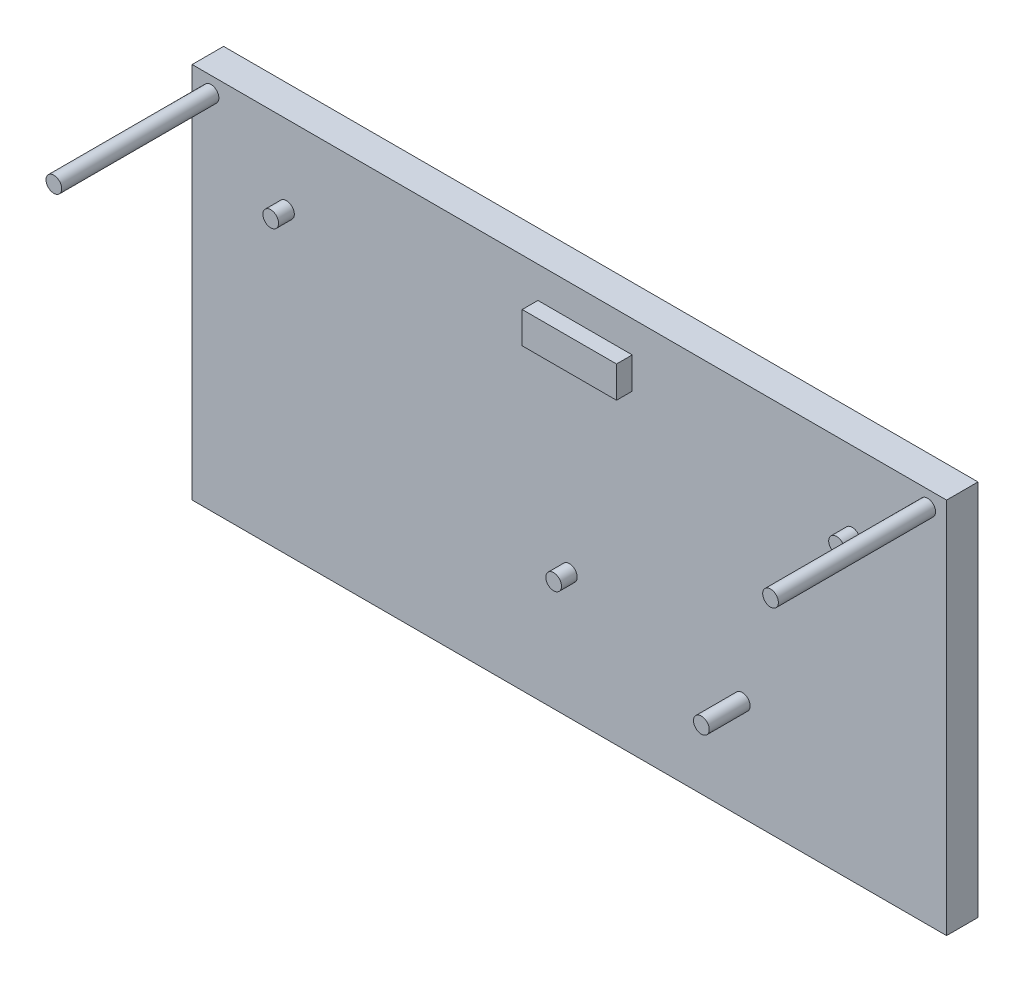
ISO-10303-21;
HEADER;
FILE_DESCRIPTION(('STEP AP214'),'2;1');
FILE_NAME('part.step','',(''),(''),'','','');
FILE_SCHEMA(('AUTOMOTIVE_DESIGN { 1 0 10303 214 1 1 1 1 }'));
ENDSEC;
DATA;
#1=APPLICATION_CONTEXT('core data for automotive mechanical design processes');
#2=APPLICATION_PROTOCOL_DEFINITION('international standard','automotive_design',2000,#1);
#3=PRODUCT_CONTEXT('',#1,'mechanical');
#4=PRODUCT('Part','Part','',(#3));
#5=PRODUCT_RELATED_PRODUCT_CATEGORY('part','',(#4));
#6=PRODUCT_DEFINITION_FORMATION('','',#4);
#7=PRODUCT_DEFINITION_CONTEXT('part definition',#1,'design');
#8=PRODUCT_DEFINITION('design','',#6,#7);
#9=PRODUCT_DEFINITION_SHAPE('','',#8);
#10=(LENGTH_UNIT() NAMED_UNIT(*) SI_UNIT(.MILLI.,.METRE.));
#11=(NAMED_UNIT(*) PLANE_ANGLE_UNIT() SI_UNIT($,.RADIAN.));
#12=(NAMED_UNIT(*) SI_UNIT($,.STERADIAN.) SOLID_ANGLE_UNIT());
#13=UNCERTAINTY_MEASURE_WITH_UNIT(LENGTH_MEASURE(1.E-05),#10,'distance_accuracy_value','');
#14=(GEOMETRIC_REPRESENTATION_CONTEXT(3) GLOBAL_UNCERTAINTY_ASSIGNED_CONTEXT((#13)) GLOBAL_UNIT_ASSIGNED_CONTEXT((#10,
#11,#12)) REPRESENTATION_CONTEXT('',''));
#15=CARTESIAN_POINT('',(0.,0.,0.));
#16=DIRECTION('',(0.,0.,1.));
#17=DIRECTION('',(1.,0.,0.));
#18=AXIS2_PLACEMENT_3D('',#15,#16,#17);
#19=CARTESIAN_POINT('',(60.,60.,0.));
#20=DIRECTION('',(0.,0.,1.));
#21=DIRECTION('',(1.,0.,0.));
#22=AXIS2_PLACEMENT_3D('',#19,#20,#21);
#23=PLANE('',#22);
#24=CARTESIAN_POINT('',(-114.,115.,0.));
#25=DIRECTION('',(0.,0.,-1.));
#26=DIRECTION('',(-1.,0.,0.));
#27=AXIS2_PLACEMENT_3D('',#24,#25,#26);
#28=CIRCLE('',#27,2.5);
#29=CARTESIAN_POINT('',(-111.5,115.,0.));
#30=VERTEX_POINT('',#29);
#31=EDGE_CURVE('E205',#30,#30,#28,.T.);
#32=ORIENTED_EDGE('',*,*,#31,.T.);
#33=EDGE_LOOP('',(#32));
#34=FACE_BOUND('',#33,.T.);
#35=CARTESIAN_POINT('',(114.,115.,0.));
#36=DIRECTION('',(0.,0.,-1.));
#37=DIRECTION('',(-1.,0.,0.));
#38=AXIS2_PLACEMENT_3D('',#35,#36,#37);
#39=CIRCLE('',#38,2.5);
#40=CARTESIAN_POINT('',(116.5,115.,0.));
#41=VERTEX_POINT('',#40);
#42=EDGE_CURVE('E196',#41,#41,#39,.T.);
#43=ORIENTED_EDGE('',*,*,#42,.T.);
#44=EDGE_LOOP('',(#43));
#45=FACE_BOUND('',#44,.T.);
#46=CARTESIAN_POINT('',(0.,40.,0.));
#47=DIRECTION('',(0.,0.,-1.));
#48=DIRECTION('',(-1.,0.,0.));
#49=AXIS2_PLACEMENT_3D('',#46,#47,#48);
#50=CIRCLE('',#49,2.5);
#51=CARTESIAN_POINT('',(2.5,40.,0.));
#52=VERTEX_POINT('',#51);
#53=EDGE_CURVE('E223',#52,#52,#50,.T.);
#54=ORIENTED_EDGE('',*,*,#53,.T.);
#55=EDGE_LOOP('',(#54));
#56=FACE_BOUND('',#55,.T.);
#57=CARTESIAN_POINT('',(-90.,95.,0.));
#58=DIRECTION('',(0.,0.,-1.));
#59=DIRECTION('',(-1.,0.,0.));
#60=AXIS2_PLACEMENT_3D('',#57,#58,#59);
#61=CIRCLE('',#60,2.5);
#62=CARTESIAN_POINT('',(-87.5,95.,0.));
#63=VERTEX_POINT('',#62);
#64=EDGE_CURVE('E228',#63,#63,#61,.T.);
#65=ORIENTED_EDGE('',*,*,#64,.T.);
#66=EDGE_LOOP('',(#65));
#67=FACE_BOUND('',#66,.T.);
#68=CARTESIAN_POINT('',(90.,95.,0.));
#69=DIRECTION('',(0.,0.,-1.));
#70=DIRECTION('',(-1.,0.,0.));
#71=AXIS2_PLACEMENT_3D('',#68,#69,#70);
#72=CIRCLE('',#71,2.5);
#73=CARTESIAN_POINT('',(92.5,95.,0.));
#74=VERTEX_POINT('',#73);
#75=EDGE_CURVE('E186',#74,#74,#72,.T.);
#76=ORIENTED_EDGE('',*,*,#75,.T.);
#77=EDGE_LOOP('',(#76));
#78=FACE_BOUND('',#77,.T.);
#79=DIRECTION('',(0.,-1.,0.));
#80=VECTOR('',#79,1.);
#81=CARTESIAN_POINT('',(20.,110.,0.));
#82=LINE('',#81,#80);
#83=CARTESIAN_POINT('',(20.,110.,0.));
#84=VERTEX_POINT('',#83);
#85=CARTESIAN_POINT('',(20.,100.,0.));
#86=VERTEX_POINT('',#85);
#87=EDGE_CURVE('E150',#84,#86,#82,.T.);
#88=ORIENTED_EDGE('',*,*,#87,.T.);
#89=DIRECTION('',(-1.,0.,0.));
#90=VECTOR('',#89,1.);
#91=CARTESIAN_POINT('',(20.,100.,0.));
#92=LINE('',#91,#90);
#93=CARTESIAN_POINT('',(-10.,100.,0.));
#94=VERTEX_POINT('',#93);
#95=EDGE_CURVE('E267',#86,#94,#92,.T.);
#96=ORIENTED_EDGE('',*,*,#95,.T.);
#97=DIRECTION('',(0.,1.,0.));
#98=VECTOR('',#97,1.);
#99=CARTESIAN_POINT('',(-10.,100.,0.));
#100=LINE('',#99,#98);
#101=CARTESIAN_POINT('',(-10.,110.,0.));
#102=VERTEX_POINT('',#101);
#103=EDGE_CURVE('E153',#94,#102,#100,.T.);
#104=ORIENTED_EDGE('',*,*,#103,.T.);
#105=DIRECTION('',(1.,0.,0.));
#106=VECTOR('',#105,1.);
#107=CARTESIAN_POINT('',(-10.,110.,0.));
#108=LINE('',#107,#106);
#109=EDGE_CURVE('E145',#102,#84,#108,.T.);
#110=ORIENTED_EDGE('',*,*,#109,.T.);
#111=EDGE_LOOP('',(#88,#96,#104,#110));
#112=FACE_BOUND('',#111,.T.);
#113=CARTESIAN_POINT('',(55.,32.,0.));
#114=DIRECTION('',(0.,0.,-1.));
#115=DIRECTION('',(-1.,0.,0.));
#116=AXIS2_PLACEMENT_3D('',#113,#114,#115);
#117=CIRCLE('',#116,2.5);
#118=CARTESIAN_POINT('',(57.5,32.,0.));
#119=VERTEX_POINT('',#118);
#120=EDGE_CURVE('E187',#119,#119,#117,.T.);
#121=ORIENTED_EDGE('',*,*,#120,.T.);
#122=EDGE_LOOP('',(#121));
#123=FACE_BOUND('',#122,.T.);
#124=DIRECTION('',(1.,0.,0.));
#125=VECTOR('',#124,1.);
#126=CARTESIAN_POINT('',(-120.,0.,0.));
#127=LINE('',#126,#125);
#128=CARTESIAN_POINT('',(-120.,0.,0.));
#129=VERTEX_POINT('',#128);
#130=CARTESIAN_POINT('',(120.,0.,0.));
#131=VERTEX_POINT('',#130);
#132=EDGE_CURVE('E9',#129,#131,#127,.T.);
#133=ORIENTED_EDGE('',*,*,#132,.T.);
#134=DIRECTION('',(0.,1.,0.));
#135=VECTOR('',#134,1.);
#136=CARTESIAN_POINT('',(120.,0.,0.));
#137=LINE('',#136,#135);
#138=CARTESIAN_POINT('',(120.,120.,0.));
#139=VERTEX_POINT('',#138);
#140=EDGE_CURVE('E191',#131,#139,#137,.T.);
#141=ORIENTED_EDGE('',*,*,#140,.T.);
#142=DIRECTION('',(-1.,0.,0.));
#143=VECTOR('',#142,1.);
#144=CARTESIAN_POINT('',(120.,120.,0.));
#145=LINE('',#144,#143);
#146=CARTESIAN_POINT('',(-120.,120.,0.));
#147=VERTEX_POINT('',#146);
#148=EDGE_CURVE('E207',#139,#147,#145,.T.);
#149=ORIENTED_EDGE('',*,*,#148,.T.);
#150=DIRECTION('',(0.,-1.,0.));
#151=VECTOR('',#150,1.);
#152=CARTESIAN_POINT('',(-120.,120.,0.));
#153=LINE('',#152,#151);
#154=EDGE_CURVE('E242',#147,#129,#153,.T.);
#155=ORIENTED_EDGE('',*,*,#154,.T.);
#156=EDGE_LOOP('',(#133,#141,#149,#155));
#157=FACE_BOUND('',#156,.T.);
#158=ADVANCED_FACE('F15',(#34,#45,#56,#67,#78,#112,#123,#157),#23,.T.);
#159=CARTESIAN_POINT('',(60.,60.,-10.));
#160=DIRECTION('',(0.,0.,1.));
#161=DIRECTION('',(1.,0.,0.));
#162=AXIS2_PLACEMENT_3D('',#159,#160,#161);
#163=PLANE('',#162);
#164=DIRECTION('',(0.,1.,0.));
#165=VECTOR('',#164,1.);
#166=CARTESIAN_POINT('',(120.,0.,-10.));
#167=LINE('',#166,#165);
#168=CARTESIAN_POINT('',(120.,0.,-10.));
#169=VERTEX_POINT('',#168);
#170=CARTESIAN_POINT('',(120.,120.,-10.));
#171=VERTEX_POINT('',#170);
#172=EDGE_CURVE('E263',#169,#171,#167,.T.);
#173=ORIENTED_EDGE('',*,*,#172,.F.);
#174=DIRECTION('',(1.,0.,0.));
#175=VECTOR('',#174,1.);
#176=CARTESIAN_POINT('',(-120.,0.,-10.));
#177=LINE('',#176,#175);
#178=CARTESIAN_POINT('',(-120.,0.,-10.));
#179=VERTEX_POINT('',#178);
#180=EDGE_CURVE('E26',#179,#169,#177,.T.);
#181=ORIENTED_EDGE('',*,*,#180,.F.);
#182=DIRECTION('',(0.,-1.,0.));
#183=VECTOR('',#182,1.);
#184=CARTESIAN_POINT('',(-120.,120.,-10.));
#185=LINE('',#184,#183);
#186=CARTESIAN_POINT('',(-120.,120.,-10.));
#187=VERTEX_POINT('',#186);
#188=EDGE_CURVE('E182',#187,#179,#185,.T.);
#189=ORIENTED_EDGE('',*,*,#188,.F.);
#190=DIRECTION('',(-1.,0.,0.));
#191=VECTOR('',#190,1.);
#192=CARTESIAN_POINT('',(120.,120.,-10.));
#193=LINE('',#192,#191);
#194=EDGE_CURVE('E214',#171,#187,#193,.T.);
#195=ORIENTED_EDGE('',*,*,#194,.F.);
#196=EDGE_LOOP('',(#173,#181,#189,#195));
#197=FACE_BOUND('',#196,.T.);
#198=ADVANCED_FACE('F303',(#197),#163,.F.);
#199=CARTESIAN_POINT('',(0.,0.,0.));
#200=DIRECTION('',(0.,-1.,0.));
#201=DIRECTION('',(0.,0.,-1.));
#202=AXIS2_PLACEMENT_3D('',#199,#200,#201);
#203=PLANE('',#202);
#204=ORIENTED_EDGE('',*,*,#180,.T.);
#205=DIRECTION('',(0.,0.,-1.));
#206=VECTOR('',#205,1.);
#207=CARTESIAN_POINT('',(120.,0.,0.));
#208=LINE('',#207,#206);
#209=EDGE_CURVE('E194',#131,#169,#208,.T.);
#210=ORIENTED_EDGE('',*,*,#209,.F.);
#211=ORIENTED_EDGE('',*,*,#132,.F.);
#212=DIRECTION('',(0.,0.,-1.));
#213=VECTOR('',#212,1.);
#214=CARTESIAN_POINT('',(-120.,0.,0.));
#215=LINE('',#214,#213);
#216=EDGE_CURVE('E256',#129,#179,#215,.T.);
#217=ORIENTED_EDGE('',*,*,#216,.T.);
#218=EDGE_LOOP('',(#204,#210,#211,#217));
#219=FACE_BOUND('',#218,.T.);
#220=ADVANCED_FACE('F403',(#219),#203,.T.);
#221=CARTESIAN_POINT('',(120.,120.,0.));
#222=DIRECTION('',(0.,1.,0.));
#223=DIRECTION('',(1.,0.,0.));
#224=AXIS2_PLACEMENT_3D('',#221,#222,#223);
#225=PLANE('',#224);
#226=ORIENTED_EDGE('',*,*,#194,.T.);
#227=DIRECTION('',(0.,0.,-1.));
#228=VECTOR('',#227,1.);
#229=CARTESIAN_POINT('',(-120.,120.,0.));
#230=LINE('',#229,#228);
#231=EDGE_CURVE('E259',#147,#187,#230,.T.);
#232=ORIENTED_EDGE('',*,*,#231,.F.);
#233=ORIENTED_EDGE('',*,*,#148,.F.);
#234=DIRECTION('',(0.,0.,-1.));
#235=VECTOR('',#234,1.);
#236=CARTESIAN_POINT('',(120.,120.,0.));
#237=LINE('',#236,#235);
#238=EDGE_CURVE('E195',#139,#171,#237,.T.);
#239=ORIENTED_EDGE('',*,*,#238,.T.);
#240=EDGE_LOOP('',(#226,#232,#233,#239));
#241=FACE_BOUND('',#240,.T.);
#242=ADVANCED_FACE('F297',(#241),#225,.T.);
#243=CARTESIAN_POINT('',(120.,0.,0.));
#244=DIRECTION('',(1.,0.,0.));
#245=DIRECTION('',(0.,1.,0.));
#246=AXIS2_PLACEMENT_3D('',#243,#244,#245);
#247=PLANE('',#246);
#248=ORIENTED_EDGE('',*,*,#172,.T.);
#249=ORIENTED_EDGE('',*,*,#238,.F.);
#250=ORIENTED_EDGE('',*,*,#140,.F.);
#251=ORIENTED_EDGE('',*,*,#209,.T.);
#252=EDGE_LOOP('',(#248,#249,#250,#251));
#253=FACE_BOUND('',#252,.T.);
#254=ADVANCED_FACE('F301',(#253),#247,.T.);
#255=CARTESIAN_POINT('',(-120.,120.,0.));
#256=DIRECTION('',(-1.,0.,0.));
#257=DIRECTION('',(0.,0.,1.));
#258=AXIS2_PLACEMENT_3D('',#255,#256,#257);
#259=PLANE('',#258);
#260=ORIENTED_EDGE('',*,*,#188,.T.);
#261=ORIENTED_EDGE('',*,*,#216,.F.);
#262=ORIENTED_EDGE('',*,*,#154,.F.);
#263=ORIENTED_EDGE('',*,*,#231,.T.);
#264=EDGE_LOOP('',(#260,#261,#262,#263));
#265=FACE_BOUND('',#264,.T.);
#266=ADVANCED_FACE('F402',(#265),#259,.T.);
#267=CARTESIAN_POINT('',(-114.,115.,50.));
#268=DIRECTION('',(0.,0.,-1.));
#269=DIRECTION('',(0.,-1.,0.));
#270=AXIS2_PLACEMENT_3D('',#267,#268,#269);
#271=PLANE('',#270);
#272=CARTESIAN_POINT('',(-114.,115.,50.));
#273=DIRECTION('',(0.,0.,-1.));
#274=DIRECTION('',(-1.,0.,0.));
#275=AXIS2_PLACEMENT_3D('',#272,#273,#274);
#276=CIRCLE('',#275,2.5);
#277=CARTESIAN_POINT('',(-111.5,115.,50.));
#278=VERTEX_POINT('',#277);
#279=EDGE_CURVE('E199',#278,#278,#276,.T.);
#280=ORIENTED_EDGE('',*,*,#279,.F.);
#281=EDGE_LOOP('',(#280));
#282=FACE_BOUND('',#281,.T.);
#283=ADVANCED_FACE('F428',(#282),#271,.F.);
#284=CARTESIAN_POINT('',(-114.,115.,0.));
#285=DIRECTION('',(0.,0.,1.));
#286=DIRECTION('',(-1.,0.,0.));
#287=AXIS2_PLACEMENT_3D('',#284,#285,#286);
#288=CYLINDRICAL_SURFACE('',#287,2.5);
#289=ORIENTED_EDGE('',*,*,#31,.F.);
#290=EDGE_LOOP('',(#289));
#291=FACE_BOUND('',#290,.T.);
#292=ORIENTED_EDGE('',*,*,#279,.T.);
#293=EDGE_LOOP('',(#292));
#294=FACE_BOUND('',#293,.T.);
#295=ADVANCED_FACE('F431',(#291,#294),#288,.T.);
#296=CARTESIAN_POINT('',(114.,115.,50.));
#297=DIRECTION('',(0.,0.,-1.));
#298=DIRECTION('',(0.,-1.,0.));
#299=AXIS2_PLACEMENT_3D('',#296,#297,#298);
#300=PLANE('',#299);
#301=CARTESIAN_POINT('',(114.,115.,50.));
#302=DIRECTION('',(0.,0.,-1.));
#303=DIRECTION('',(-1.,0.,0.));
#304=AXIS2_PLACEMENT_3D('',#301,#302,#303);
#305=CIRCLE('',#304,2.5);
#306=CARTESIAN_POINT('',(116.5,115.,50.));
#307=VERTEX_POINT('',#306);
#308=EDGE_CURVE('E200',#307,#307,#305,.T.);
#309=ORIENTED_EDGE('',*,*,#308,.F.);
#310=EDGE_LOOP('',(#309));
#311=FACE_BOUND('',#310,.T.);
#312=ADVANCED_FACE('F421',(#311),#300,.F.);
#313=CARTESIAN_POINT('',(114.,115.,0.));
#314=DIRECTION('',(0.,0.,1.));
#315=DIRECTION('',(-1.,0.,0.));
#316=AXIS2_PLACEMENT_3D('',#313,#314,#315);
#317=CYLINDRICAL_SURFACE('',#316,2.5);
#318=ORIENTED_EDGE('',*,*,#42,.F.);
#319=EDGE_LOOP('',(#318));
#320=FACE_BOUND('',#319,.T.);
#321=ORIENTED_EDGE('',*,*,#308,.T.);
#322=EDGE_LOOP('',(#321));
#323=FACE_BOUND('',#322,.T.);
#324=ADVANCED_FACE('F474',(#320,#323),#317,.T.);
#325=CARTESIAN_POINT('',(0.,40.,5.));
#326=DIRECTION('',(0.,0.,-1.));
#327=DIRECTION('',(0.,-1.,0.));
#328=AXIS2_PLACEMENT_3D('',#325,#326,#327);
#329=PLANE('',#328);
#330=CARTESIAN_POINT('',(0.,40.,5.));
#331=DIRECTION('',(0.,0.,-1.));
#332=DIRECTION('',(-1.,0.,0.));
#333=AXIS2_PLACEMENT_3D('',#330,#331,#332);
#334=CIRCLE('',#333,2.5);
#335=CARTESIAN_POINT('',(2.5,40.,5.));
#336=VERTEX_POINT('',#335);
#337=EDGE_CURVE('E226',#336,#336,#334,.T.);
#338=ORIENTED_EDGE('',*,*,#337,.F.);
#339=EDGE_LOOP('',(#338));
#340=FACE_BOUND('',#339,.T.);
#341=ADVANCED_FACE('F447',(#340),#329,.F.);
#342=CARTESIAN_POINT('',(0.,40.,0.));
#343=DIRECTION('',(0.,0.,1.));
#344=DIRECTION('',(-1.,0.,0.));
#345=AXIS2_PLACEMENT_3D('',#342,#343,#344);
#346=CYLINDRICAL_SURFACE('',#345,2.5);
#347=ORIENTED_EDGE('',*,*,#53,.F.);
#348=EDGE_LOOP('',(#347));
#349=FACE_BOUND('',#348,.T.);
#350=ORIENTED_EDGE('',*,*,#337,.T.);
#351=EDGE_LOOP('',(#350));
#352=FACE_BOUND('',#351,.T.);
#353=ADVANCED_FACE('F443',(#349,#352),#346,.T.);
#354=CARTESIAN_POINT('',(-90.,95.,5.));
#355=DIRECTION('',(0.,0.,-1.));
#356=DIRECTION('',(0.,-1.,0.));
#357=AXIS2_PLACEMENT_3D('',#354,#355,#356);
#358=PLANE('',#357);
#359=CARTESIAN_POINT('',(-90.,95.,5.));
#360=DIRECTION('',(0.,0.,-1.));
#361=DIRECTION('',(-1.,0.,0.));
#362=AXIS2_PLACEMENT_3D('',#359,#360,#361);
#363=CIRCLE('',#362,2.5);
#364=CARTESIAN_POINT('',(-87.5,95.,5.));
#365=VERTEX_POINT('',#364);
#366=EDGE_CURVE('E202',#365,#365,#363,.T.);
#367=ORIENTED_EDGE('',*,*,#366,.F.);
#368=EDGE_LOOP('',(#367));
#369=FACE_BOUND('',#368,.T.);
#370=ADVANCED_FACE('F446',(#369),#358,.F.);
#371=CARTESIAN_POINT('',(-90.,95.,0.));
#372=DIRECTION('',(0.,0.,1.));
#373=DIRECTION('',(-1.,0.,0.));
#374=AXIS2_PLACEMENT_3D('',#371,#372,#373);
#375=CYLINDRICAL_SURFACE('',#374,2.5);
#376=ORIENTED_EDGE('',*,*,#64,.F.);
#377=EDGE_LOOP('',(#376));
#378=FACE_BOUND('',#377,.T.);
#379=ORIENTED_EDGE('',*,*,#366,.T.);
#380=EDGE_LOOP('',(#379));
#381=FACE_BOUND('',#380,.T.);
#382=ADVANCED_FACE('F455',(#378,#381),#375,.T.);
#383=CARTESIAN_POINT('',(90.,95.,5.));
#384=DIRECTION('',(0.,0.,-1.));
#385=DIRECTION('',(0.,-1.,0.));
#386=AXIS2_PLACEMENT_3D('',#383,#384,#385);
#387=PLANE('',#386);
#388=CARTESIAN_POINT('',(90.,95.,5.));
#389=DIRECTION('',(0.,0.,-1.));
#390=DIRECTION('',(-1.,0.,0.));
#391=AXIS2_PLACEMENT_3D('',#388,#389,#390);
#392=CIRCLE('',#391,2.5);
#393=CARTESIAN_POINT('',(92.5,95.,5.));
#394=VERTEX_POINT('',#393);
#395=EDGE_CURVE('E158',#394,#394,#392,.T.);
#396=ORIENTED_EDGE('',*,*,#395,.F.);
#397=EDGE_LOOP('',(#396));
#398=FACE_BOUND('',#397,.T.);
#399=ADVANCED_FACE('F452',(#398),#387,.F.);
#400=CARTESIAN_POINT('',(90.,95.,0.));
#401=DIRECTION('',(0.,0.,1.));
#402=DIRECTION('',(-1.,0.,0.));
#403=AXIS2_PLACEMENT_3D('',#400,#401,#402);
#404=CYLINDRICAL_SURFACE('',#403,2.5);
#405=ORIENTED_EDGE('',*,*,#75,.F.);
#406=EDGE_LOOP('',(#405));
#407=FACE_BOUND('',#406,.T.);
#408=ORIENTED_EDGE('',*,*,#395,.T.);
#409=EDGE_LOOP('',(#408));
#410=FACE_BOUND('',#409,.T.);
#411=ADVANCED_FACE('F425',(#407,#410),#404,.T.);
#412=CARTESIAN_POINT('',(5.,105.,5.));
#413=DIRECTION('',(0.,0.,1.));
#414=DIRECTION('',(1.,0.,0.));
#415=AXIS2_PLACEMENT_3D('',#412,#413,#414);
#416=PLANE('',#415);
#417=DIRECTION('',(0.,-1.,0.));
#418=VECTOR('',#417,1.);
#419=CARTESIAN_POINT('',(20.,110.,5.));
#420=LINE('',#419,#418);
#421=CARTESIAN_POINT('',(20.,110.,5.));
#422=VERTEX_POINT('',#421);
#423=CARTESIAN_POINT('',(20.,100.,5.));
#424=VERTEX_POINT('',#423);
#425=EDGE_CURVE('E19',#422,#424,#420,.T.);
#426=ORIENTED_EDGE('',*,*,#425,.F.);
#427=DIRECTION('',(1.,0.,0.));
#428=VECTOR('',#427,1.);
#429=CARTESIAN_POINT('',(-10.,110.,5.));
#430=LINE('',#429,#428);
#431=CARTESIAN_POINT('',(-10.,110.,5.));
#432=VERTEX_POINT('',#431);
#433=EDGE_CURVE('E159',#432,#422,#430,.T.);
#434=ORIENTED_EDGE('',*,*,#433,.F.);
#435=DIRECTION('',(0.,1.,0.));
#436=VECTOR('',#435,1.);
#437=CARTESIAN_POINT('',(-10.,100.,5.));
#438=LINE('',#437,#436);
#439=CARTESIAN_POINT('',(-10.,100.,5.));
#440=VERTEX_POINT('',#439);
#441=EDGE_CURVE('E255',#440,#432,#438,.T.);
#442=ORIENTED_EDGE('',*,*,#441,.F.);
#443=DIRECTION('',(-1.,0.,0.));
#444=VECTOR('',#443,1.);
#445=CARTESIAN_POINT('',(20.,100.,5.));
#446=LINE('',#445,#444);
#447=EDGE_CURVE('E168',#424,#440,#446,.T.);
#448=ORIENTED_EDGE('',*,*,#447,.F.);
#449=EDGE_LOOP('',(#426,#434,#442,#448));
#450=FACE_BOUND('',#449,.T.);
#451=ADVANCED_FACE('F284',(#450),#416,.T.);
#452=CARTESIAN_POINT('',(0.,110.,0.));
#453=DIRECTION('',(0.,1.,0.));
#454=DIRECTION('',(1.,0.,0.));
#455=AXIS2_PLACEMENT_3D('',#452,#453,#454);
#456=PLANE('',#455);
#457=ORIENTED_EDGE('',*,*,#433,.T.);
#458=DIRECTION('',(0.,0.,1.));
#459=VECTOR('',#458,1.);
#460=CARTESIAN_POINT('',(20.,110.,0.));
#461=LINE('',#460,#459);
#462=EDGE_CURVE('E162',#84,#422,#461,.T.);
#463=ORIENTED_EDGE('',*,*,#462,.F.);
#464=ORIENTED_EDGE('',*,*,#109,.F.);
#465=DIRECTION('',(0.,0.,1.));
#466=VECTOR('',#465,1.);
#467=CARTESIAN_POINT('',(-10.,110.,0.));
#468=LINE('',#467,#466);
#469=EDGE_CURVE('E252',#102,#432,#468,.T.);
#470=ORIENTED_EDGE('',*,*,#469,.T.);
#471=EDGE_LOOP('',(#457,#463,#464,#470));
#472=FACE_BOUND('',#471,.T.);
#473=ADVANCED_FACE('F163',(#472),#456,.T.);
#474=CARTESIAN_POINT('',(-10.,100.,0.));
#475=DIRECTION('',(-1.,0.,0.));
#476=DIRECTION('',(0.,0.,1.));
#477=AXIS2_PLACEMENT_3D('',#474,#475,#476);
#478=PLANE('',#477);
#479=ORIENTED_EDGE('',*,*,#441,.T.);
#480=ORIENTED_EDGE('',*,*,#469,.F.);
#481=ORIENTED_EDGE('',*,*,#103,.F.);
#482=DIRECTION('',(0.,0.,1.));
#483=VECTOR('',#482,1.);
#484=CARTESIAN_POINT('',(-10.,100.,0.));
#485=LINE('',#484,#483);
#486=EDGE_CURVE('E247',#94,#440,#485,.T.);
#487=ORIENTED_EDGE('',*,*,#486,.T.);
#488=EDGE_LOOP('',(#479,#480,#481,#487));
#489=FACE_BOUND('',#488,.T.);
#490=ADVANCED_FACE('F281',(#489),#478,.T.);
#491=CARTESIAN_POINT('',(20.,100.,0.));
#492=DIRECTION('',(0.,-1.,0.));
#493=DIRECTION('',(0.,0.,-1.));
#494=AXIS2_PLACEMENT_3D('',#491,#492,#493);
#495=PLANE('',#494);
#496=ORIENTED_EDGE('',*,*,#447,.T.);
#497=ORIENTED_EDGE('',*,*,#486,.F.);
#498=ORIENTED_EDGE('',*,*,#95,.F.);
#499=DIRECTION('',(0.,0.,1.));
#500=VECTOR('',#499,1.);
#501=CARTESIAN_POINT('',(20.,100.,0.));
#502=LINE('',#501,#500);
#503=EDGE_CURVE('E172',#86,#424,#502,.T.);
#504=ORIENTED_EDGE('',*,*,#503,.T.);
#505=EDGE_LOOP('',(#496,#497,#498,#504));
#506=FACE_BOUND('',#505,.T.);
#507=ADVANCED_FACE('F17',(#506),#495,.T.);
#508=CARTESIAN_POINT('',(20.,110.,0.));
#509=DIRECTION('',(1.,0.,0.));
#510=DIRECTION('',(0.,1.,0.));
#511=AXIS2_PLACEMENT_3D('',#508,#509,#510);
#512=PLANE('',#511);
#513=ORIENTED_EDGE('',*,*,#425,.T.);
#514=ORIENTED_EDGE('',*,*,#503,.F.);
#515=ORIENTED_EDGE('',*,*,#87,.F.);
#516=ORIENTED_EDGE('',*,*,#462,.T.);
#517=EDGE_LOOP('',(#513,#514,#515,#516));
#518=FACE_BOUND('',#517,.T.);
#519=ADVANCED_FACE('F170',(#518),#512,.T.);
#520=CARTESIAN_POINT('',(55.,32.,13.));
#521=DIRECTION('',(0.,0.,-1.));
#522=DIRECTION('',(0.,-1.,0.));
#523=AXIS2_PLACEMENT_3D('',#520,#521,#522);
#524=PLANE('',#523);
#525=CARTESIAN_POINT('',(55.,32.,13.));
#526=DIRECTION('',(0.,0.,-1.));
#527=DIRECTION('',(-1.,0.,0.));
#528=AXIS2_PLACEMENT_3D('',#525,#526,#527);
#529=CIRCLE('',#528,2.5);
#530=CARTESIAN_POINT('',(57.5,32.,13.));
#531=VERTEX_POINT('',#530);
#532=EDGE_CURVE('E189',#531,#531,#529,.T.);
#533=ORIENTED_EDGE('',*,*,#532,.F.);
#534=EDGE_LOOP('',(#533));
#535=FACE_BOUND('',#534,.T.);
#536=ADVANCED_FACE('F436',(#535),#524,.F.);
#537=CARTESIAN_POINT('',(55.,32.,0.));
#538=DIRECTION('',(0.,0.,1.));
#539=DIRECTION('',(-1.,0.,0.));
#540=AXIS2_PLACEMENT_3D('',#537,#538,#539);
#541=CYLINDRICAL_SURFACE('',#540,2.5);
#542=ORIENTED_EDGE('',*,*,#120,.F.);
#543=EDGE_LOOP('',(#542));
#544=FACE_BOUND('',#543,.T.);
#545=ORIENTED_EDGE('',*,*,#532,.T.);
#546=EDGE_LOOP('',(#545));
#547=FACE_BOUND('',#546,.T.);
#548=ADVANCED_FACE('F433',(#544,#547),#541,.T.);
#549=CLOSED_SHELL('',(#158,#198,#220,#242,#254,#266,#283,#295,#312,#324,#341,#353,#370,#382,
#399,#411,#451,#473,#490,#507,#519,#536,#548));
#550=MANIFOLD_SOLID_BREP('B1',#549);
#551=ADVANCED_BREP_SHAPE_REPRESENTATION('',(#18,#550),#14);
#552=SHAPE_DEFINITION_REPRESENTATION(#9,#551);
ENDSEC;
END-ISO-10303-21;
